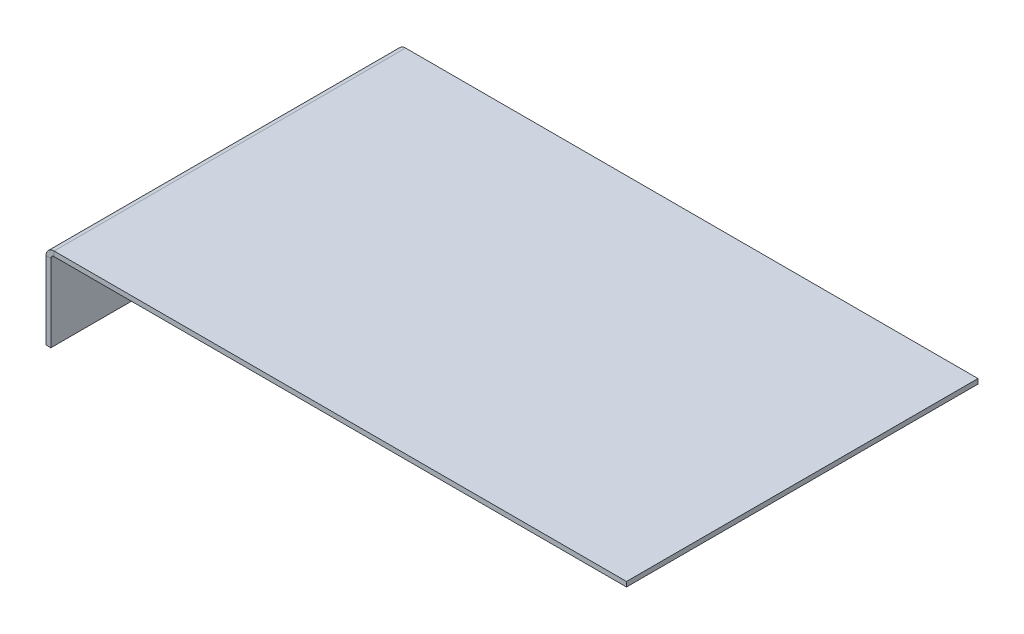
ISO-10303-21;
HEADER;
FILE_DESCRIPTION(('STEP AP214'),'2;1');
FILE_NAME('part.step','',(''),(''),'','','');
FILE_SCHEMA(('AUTOMOTIVE_DESIGN { 1 0 10303 214 1 1 1 1 }'));
ENDSEC;
DATA;
#1=APPLICATION_CONTEXT('core data for automotive mechanical design processes');
#2=APPLICATION_PROTOCOL_DEFINITION('international standard','automotive_design',2000,#1);
#3=PRODUCT_CONTEXT('',#1,'mechanical');
#4=PRODUCT('Part','Part','',(#3));
#5=PRODUCT_RELATED_PRODUCT_CATEGORY('part','',(#4));
#6=PRODUCT_DEFINITION_FORMATION('','',#4);
#7=PRODUCT_DEFINITION_CONTEXT('part definition',#1,'design');
#8=PRODUCT_DEFINITION('design','',#6,#7);
#9=PRODUCT_DEFINITION_SHAPE('','',#8);
#10=(LENGTH_UNIT() NAMED_UNIT(*) SI_UNIT(.MILLI.,.METRE.));
#11=(NAMED_UNIT(*) PLANE_ANGLE_UNIT() SI_UNIT($,.RADIAN.));
#12=(NAMED_UNIT(*) SI_UNIT($,.STERADIAN.) SOLID_ANGLE_UNIT());
#13=UNCERTAINTY_MEASURE_WITH_UNIT(LENGTH_MEASURE(1.E-05),#10,'distance_accuracy_value','');
#14=(GEOMETRIC_REPRESENTATION_CONTEXT(3) GLOBAL_UNCERTAINTY_ASSIGNED_CONTEXT((#13)) GLOBAL_UNIT_ASSIGNED_CONTEXT((#10,
#11,#12)) REPRESENTATION_CONTEXT('',''));
#15=CARTESIAN_POINT('',(0.,0.,0.));
#16=DIRECTION('',(0.,0.,1.));
#17=DIRECTION('',(1.,0.,0.));
#18=AXIS2_PLACEMENT_3D('',#15,#16,#17);
#19=CARTESIAN_POINT('',(-90.,-1.5,-54.5));
#20=DIRECTION('',(0.,0.,-1.));
#21=DIRECTION('',(-1.,0.,0.));
#22=AXIS2_PLACEMENT_3D('',#19,#20,#21);
#23=PLANE('',#22);
#24=DIRECTION('',(-1.,0.,0.));
#25=VECTOR('',#24,1.);
#26=CARTESIAN_POINT('',(-90.,-1.5,-54.5));
#27=LINE('',#26,#25);
#28=CARTESIAN_POINT('',(90.,-1.5,-54.5));
#29=VERTEX_POINT('',#28);
#30=CARTESIAN_POINT('',(-87.5,-1.5,-54.5));
#31=VERTEX_POINT('',#30);
#32=EDGE_CURVE('E195',#29,#31,#27,.T.);
#33=ORIENTED_EDGE('',*,*,#32,.T.);
#34=DIRECTION('',(0.,1.,0.));
#35=VECTOR('',#34,1.);
#36=CARTESIAN_POINT('',(-87.5,-1.5,-54.5));
#37=LINE('',#36,#35);
#38=CARTESIAN_POINT('',(-87.5,0.,-54.5));
#39=VERTEX_POINT('',#38);
#40=EDGE_CURVE('E183',#31,#39,#37,.T.);
#41=ORIENTED_EDGE('',*,*,#40,.T.);
#42=DIRECTION('',(-1.,0.,0.));
#43=VECTOR('',#42,1.);
#44=CARTESIAN_POINT('',(-90.,0.,-54.5));
#45=LINE('',#44,#43);
#46=CARTESIAN_POINT('',(90.,0.,-54.5));
#47=VERTEX_POINT('',#46);
#48=EDGE_CURVE('E202',#47,#39,#45,.T.);
#49=ORIENTED_EDGE('',*,*,#48,.F.);
#50=DIRECTION('',(0.,1.,0.));
#51=VECTOR('',#50,1.);
#52=CARTESIAN_POINT('',(90.,-1.5,-54.5));
#53=LINE('',#52,#51);
#54=EDGE_CURVE('E63',#29,#47,#53,.T.);
#55=ORIENTED_EDGE('',*,*,#54,.F.);
#56=EDGE_LOOP('',(#33,#41,#49,#55));
#57=FACE_BOUND('',#56,.T.);
#58=ADVANCED_FACE('F59',(#57),#23,.T.);
#59=CARTESIAN_POINT('',(0.,-1.5,0.));
#60=DIRECTION('',(0.,-1.,0.));
#61=DIRECTION('',(0.,0.,-1.));
#62=AXIS2_PLACEMENT_3D('',#59,#60,#61);
#63=PLANE('',#62);
#64=DIRECTION('',(1.,0.,0.));
#65=VECTOR('',#64,1.);
#66=CARTESIAN_POINT('',(-90.,-1.5,54.5));
#67=LINE('',#66,#65);
#68=CARTESIAN_POINT('',(-87.5,-1.5,54.5));
#69=VERTEX_POINT('',#68);
#70=CARTESIAN_POINT('',(90.,-1.5,54.5));
#71=VERTEX_POINT('',#70);
#72=EDGE_CURVE('E198',#69,#71,#67,.T.);
#73=ORIENTED_EDGE('',*,*,#72,.F.);
#74=DIRECTION('',(0.,0.,-1.));
#75=VECTOR('',#74,1.);
#76=CARTESIAN_POINT('',(-87.5,-1.5,-54.5));
#77=LINE('',#76,#75);
#78=EDGE_CURVE('E74',#31,#69,#77,.F.);
#79=ORIENTED_EDGE('',*,*,#78,.F.);
#80=ORIENTED_EDGE('',*,*,#32,.F.);
#81=DIRECTION('',(0.,0.,-1.));
#82=VECTOR('',#81,1.);
#83=CARTESIAN_POINT('',(90.,-1.5,54.5));
#84=LINE('',#83,#82);
#85=EDGE_CURVE('E192',#71,#29,#84,.T.);
#86=ORIENTED_EDGE('',*,*,#85,.F.);
#87=EDGE_LOOP('',(#73,#79,#80,#86));
#88=FACE_BOUND('',#87,.T.);
#89=ADVANCED_FACE('F236',(#88),#63,.T.);
#90=CARTESIAN_POINT('',(0.,0.,0.));
#91=DIRECTION('',(0.,-1.,0.));
#92=DIRECTION('',(0.,0.,-1.));
#93=AXIS2_PLACEMENT_3D('',#90,#91,#92);
#94=PLANE('',#93);
#95=DIRECTION('',(0.,0.,-1.));
#96=VECTOR('',#95,1.);
#97=CARTESIAN_POINT('',(-87.5,0.,-54.5));
#98=LINE('',#97,#96);
#99=CARTESIAN_POINT('',(-87.5,0.,54.5));
#100=VERTEX_POINT('',#99);
#101=EDGE_CURVE('E133',#39,#100,#98,.F.);
#102=ORIENTED_EDGE('',*,*,#101,.T.);
#103=DIRECTION('',(1.,0.,0.));
#104=VECTOR('',#103,1.);
#105=CARTESIAN_POINT('',(-90.,0.,54.5));
#106=LINE('',#105,#104);
#107=CARTESIAN_POINT('',(90.,0.,54.5));
#108=VERTEX_POINT('',#107);
#109=EDGE_CURVE('E196',#100,#108,#106,.T.);
#110=ORIENTED_EDGE('',*,*,#109,.T.);
#111=DIRECTION('',(0.,0.,-1.));
#112=VECTOR('',#111,1.);
#113=CARTESIAN_POINT('',(90.,0.,54.5));
#114=LINE('',#113,#112);
#115=EDGE_CURVE('E190',#108,#47,#114,.T.);
#116=ORIENTED_EDGE('',*,*,#115,.T.);
#117=ORIENTED_EDGE('',*,*,#48,.T.);
#118=EDGE_LOOP('',(#102,#110,#116,#117));
#119=FACE_BOUND('',#118,.T.);
#120=ADVANCED_FACE('F206',(#119),#94,.F.);
#121=CARTESIAN_POINT('',(90.,-1.5,54.5));
#122=DIRECTION('',(1.,0.,0.));
#123=DIRECTION('',(0.,0.,-1.));
#124=AXIS2_PLACEMENT_3D('',#121,#122,#123);
#125=PLANE('',#124);
#126=ORIENTED_EDGE('',*,*,#115,.F.);
#127=DIRECTION('',(0.,1.,0.));
#128=VECTOR('',#127,1.);
#129=CARTESIAN_POINT('',(90.,-1.5,54.5));
#130=LINE('',#129,#128);
#131=EDGE_CURVE('E13',#71,#108,#130,.T.);
#132=ORIENTED_EDGE('',*,*,#131,.F.);
#133=ORIENTED_EDGE('',*,*,#85,.T.);
#134=ORIENTED_EDGE('',*,*,#54,.T.);
#135=EDGE_LOOP('',(#126,#132,#133,#134));
#136=FACE_BOUND('',#135,.T.);
#137=ADVANCED_FACE('F61',(#136),#125,.T.);
#138=CARTESIAN_POINT('',(-90.,-1.5,54.5));
#139=DIRECTION('',(0.,0.,1.));
#140=DIRECTION('',(1.,0.,0.));
#141=AXIS2_PLACEMENT_3D('',#138,#139,#140);
#142=PLANE('',#141);
#143=DIRECTION('',(0.,1.,0.));
#144=VECTOR('',#143,1.);
#145=CARTESIAN_POINT('',(-87.5,-1.5,54.5));
#146=LINE('',#145,#144);
#147=EDGE_CURVE('E82',#69,#100,#146,.T.);
#148=ORIENTED_EDGE('',*,*,#147,.F.);
#149=ORIENTED_EDGE('',*,*,#72,.T.);
#150=ORIENTED_EDGE('',*,*,#131,.T.);
#151=ORIENTED_EDGE('',*,*,#109,.F.);
#152=EDGE_LOOP('',(#148,#149,#150,#151));
#153=FACE_BOUND('',#152,.T.);
#154=ADVANCED_FACE('F209',(#153),#142,.T.);
#155=CARTESIAN_POINT('',(-87.5,-2.50000000000001,54.5));
#156=DIRECTION('',(0.,0.,1.));
#157=DIRECTION('',(1.,0.,0.));
#158=AXIS2_PLACEMENT_3D('',#155,#156,#157);
#159=PLANE('',#158);
#160=DIRECTION('',(-1.,0.,0.));
#161=VECTOR('',#160,1.);
#162=CARTESIAN_POINT('',(-90.,-2.5,54.5));
#163=LINE('',#162,#161);
#164=CARTESIAN_POINT('',(-88.5,-2.5,54.5));
#165=VERTEX_POINT('',#164);
#166=CARTESIAN_POINT('',(-90.,-2.5,54.5));
#167=VERTEX_POINT('',#166);
#168=EDGE_CURVE('E178',#165,#167,#163,.T.);
#169=ORIENTED_EDGE('',*,*,#168,.F.);
#170=CARTESIAN_POINT('',(-87.5,-2.50000000000001,54.5));
#171=DIRECTION('',(0.,0.,-1.));
#172=DIRECTION('',(-1.,0.,0.));
#173=AXIS2_PLACEMENT_3D('',#170,#171,#172);
#174=CIRCLE('',#173,1.);
#175=EDGE_CURVE('E136',#69,#165,#174,.F.);
#176=ORIENTED_EDGE('',*,*,#175,.F.);
#177=ORIENTED_EDGE('',*,*,#147,.T.);
#178=CARTESIAN_POINT('',(-87.5,-2.50000000000001,54.5));
#179=DIRECTION('',(0.,0.,-1.));
#180=DIRECTION('',(-1.,0.,0.));
#181=AXIS2_PLACEMENT_3D('',#178,#179,#180);
#182=CIRCLE('',#181,2.5);
#183=EDGE_CURVE('E182',#100,#167,#182,.F.);
#184=ORIENTED_EDGE('',*,*,#183,.T.);
#185=EDGE_LOOP('',(#169,#176,#177,#184));
#186=FACE_BOUND('',#185,.T.);
#187=ADVANCED_FACE('F244',(#186),#159,.T.);
#188=CARTESIAN_POINT('',(-87.5,-2.50000000000001,-54.5));
#189=DIRECTION('',(0.,0.,1.));
#190=DIRECTION('',(1.,0.,0.));
#191=AXIS2_PLACEMENT_3D('',#188,#189,#190);
#192=PLANE('',#191);
#193=CARTESIAN_POINT('',(-87.5,-2.50000000000001,-54.5));
#194=DIRECTION('',(0.,0.,-1.));
#195=DIRECTION('',(-1.,0.,0.));
#196=AXIS2_PLACEMENT_3D('',#193,#194,#195);
#197=CIRCLE('',#196,1.);
#198=CARTESIAN_POINT('',(-88.5,-2.5,-54.5));
#199=VERTEX_POINT('',#198);
#200=EDGE_CURVE('E143',#199,#31,#197,.T.);
#201=ORIENTED_EDGE('',*,*,#200,.F.);
#202=DIRECTION('',(-1.,0.,0.));
#203=VECTOR('',#202,1.);
#204=CARTESIAN_POINT('',(-88.5,-2.5,-54.5));
#205=LINE('',#204,#203);
#206=CARTESIAN_POINT('',(-90.,-2.5,-54.5));
#207=VERTEX_POINT('',#206);
#208=EDGE_CURVE('E140',#199,#207,#205,.T.);
#209=ORIENTED_EDGE('',*,*,#208,.T.);
#210=CARTESIAN_POINT('',(-87.5,-2.50000000000001,-54.5));
#211=DIRECTION('',(0.,0.,-1.));
#212=DIRECTION('',(-1.,0.,0.));
#213=AXIS2_PLACEMENT_3D('',#210,#211,#212);
#214=CIRCLE('',#213,2.5);
#215=EDGE_CURVE('E126',#207,#39,#214,.T.);
#216=ORIENTED_EDGE('',*,*,#215,.T.);
#217=ORIENTED_EDGE('',*,*,#40,.F.);
#218=EDGE_LOOP('',(#201,#209,#216,#217));
#219=FACE_BOUND('',#218,.T.);
#220=ADVANCED_FACE('F141',(#219),#192,.F.);
#221=CARTESIAN_POINT('',(-87.5,-2.50000000000001,-54.5));
#222=DIRECTION('',(0.,0.,-1.));
#223=DIRECTION('',(-1.,0.,0.));
#224=AXIS2_PLACEMENT_3D('',#221,#222,#223);
#225=CYLINDRICAL_SURFACE('',#224,2.5);
#226=ORIENTED_EDGE('',*,*,#101,.F.);
#227=ORIENTED_EDGE('',*,*,#215,.F.);
#228=DIRECTION('',(0.,0.,-1.));
#229=VECTOR('',#228,1.);
#230=CARTESIAN_POINT('',(-90.,-2.5,0.));
#231=LINE('',#230,#229);
#232=EDGE_CURVE('E131',#167,#207,#231,.T.);
#233=ORIENTED_EDGE('',*,*,#232,.F.);
#234=ORIENTED_EDGE('',*,*,#183,.F.);
#235=EDGE_LOOP('',(#226,#227,#233,#234));
#236=FACE_BOUND('',#235,.T.);
#237=ADVANCED_FACE('F128',(#236),#225,.T.);
#238=CARTESIAN_POINT('',(-87.5,-2.50000000000001,-54.5));
#239=DIRECTION('',(0.,0.,-1.));
#240=DIRECTION('',(-1.,0.,0.));
#241=AXIS2_PLACEMENT_3D('',#238,#239,#240);
#242=CYLINDRICAL_SURFACE('',#241,1.);
#243=ORIENTED_EDGE('',*,*,#78,.T.);
#244=ORIENTED_EDGE('',*,*,#175,.T.);
#245=DIRECTION('',(0.,0.,1.));
#246=VECTOR('',#245,1.);
#247=CARTESIAN_POINT('',(-88.5,-2.5,54.5));
#248=LINE('',#247,#246);
#249=EDGE_CURVE('E148',#165,#199,#248,.F.);
#250=ORIENTED_EDGE('',*,*,#249,.T.);
#251=ORIENTED_EDGE('',*,*,#200,.T.);
#252=EDGE_LOOP('',(#243,#244,#250,#251));
#253=FACE_BOUND('',#252,.T.);
#254=ADVANCED_FACE('F215',(#253),#242,.F.);
#255=CARTESIAN_POINT('',(-90.,-1.49999999999999,-54.5));
#256=DIRECTION('',(0.,0.,-1.));
#257=DIRECTION('',(-1.,0.,0.));
#258=AXIS2_PLACEMENT_3D('',#255,#256,#257);
#259=PLANE('',#258);
#260=DIRECTION('',(0.,1.,0.));
#261=VECTOR('',#260,1.);
#262=CARTESIAN_POINT('',(-90.,-1.49999999999999,-54.5));
#263=LINE('',#262,#261);
#264=CARTESIAN_POINT('',(-90.0000000000001,-26.5,-54.5));
#265=VERTEX_POINT('',#264);
#266=EDGE_CURVE('E155',#265,#207,#263,.T.);
#267=ORIENTED_EDGE('',*,*,#266,.T.);
#268=ORIENTED_EDGE('',*,*,#208,.F.);
#269=DIRECTION('',(0.,-1.,0.));
#270=VECTOR('',#269,1.);
#271=CARTESIAN_POINT('',(-88.5,2.99760216648792E-13,-54.5));
#272=LINE('',#271,#270);
#273=CARTESIAN_POINT('',(-88.5000000000001,-26.5,-54.5));
#274=VERTEX_POINT('',#273);
#275=EDGE_CURVE('E171',#274,#199,#272,.F.);
#276=ORIENTED_EDGE('',*,*,#275,.F.);
#277=DIRECTION('',(1.,0.,0.));
#278=VECTOR('',#277,1.);
#279=CARTESIAN_POINT('',(-90.0000000000001,-26.5,-54.5));
#280=LINE('',#279,#278);
#281=EDGE_CURVE('E160',#265,#274,#280,.T.);
#282=ORIENTED_EDGE('',*,*,#281,.F.);
#283=EDGE_LOOP('',(#267,#268,#276,#282));
#284=FACE_BOUND('',#283,.T.);
#285=ADVANCED_FACE('F159',(#284),#259,.T.);
#286=CARTESIAN_POINT('',(-90.0000000000001,-26.5,54.5));
#287=DIRECTION('',(0.,0.,1.));
#288=DIRECTION('',(1.,0.,0.));
#289=AXIS2_PLACEMENT_3D('',#286,#287,#288);
#290=PLANE('',#289);
#291=DIRECTION('',(0.,1.,0.));
#292=VECTOR('',#291,1.);
#293=CARTESIAN_POINT('',(-88.5,2.99760216648792E-13,54.5));
#294=LINE('',#293,#292);
#295=CARTESIAN_POINT('',(-88.5000000000001,-26.5,54.5));
#296=VERTEX_POINT('',#295);
#297=EDGE_CURVE('E157',#165,#296,#294,.F.);
#298=ORIENTED_EDGE('',*,*,#297,.F.);
#299=ORIENTED_EDGE('',*,*,#168,.T.);
#300=DIRECTION('',(0.,-1.,0.));
#301=VECTOR('',#300,1.);
#302=CARTESIAN_POINT('',(-90.0000000000001,-26.5,54.5));
#303=LINE('',#302,#301);
#304=CARTESIAN_POINT('',(-90.0000000000001,-26.5,54.5));
#305=VERTEX_POINT('',#304);
#306=EDGE_CURVE('E156',#167,#305,#303,.T.);
#307=ORIENTED_EDGE('',*,*,#306,.T.);
#308=DIRECTION('',(1.,0.,0.));
#309=VECTOR('',#308,1.);
#310=CARTESIAN_POINT('',(-90.0000000000001,-26.5,54.5));
#311=LINE('',#310,#309);
#312=EDGE_CURVE('E162',#305,#296,#311,.T.);
#313=ORIENTED_EDGE('',*,*,#312,.T.);
#314=EDGE_LOOP('',(#298,#299,#307,#313));
#315=FACE_BOUND('',#314,.T.);
#316=ADVANCED_FACE('F222',(#315),#290,.T.);
#317=CARTESIAN_POINT('',(-90.,3.04997438657057E-13,0.));
#318=DIRECTION('',(-1.,0.,0.));
#319=DIRECTION('',(0.,-1.,0.));
#320=AXIS2_PLACEMENT_3D('',#317,#318,#319);
#321=PLANE('',#320);
#322=ORIENTED_EDGE('',*,*,#306,.F.);
#323=ORIENTED_EDGE('',*,*,#232,.T.);
#324=ORIENTED_EDGE('',*,*,#266,.F.);
#325=DIRECTION('',(0.,0.,-1.));
#326=VECTOR('',#325,1.);
#327=CARTESIAN_POINT('',(-90.0000000000001,-26.5,-54.5));
#328=LINE('',#327,#326);
#329=EDGE_CURVE('E163',#305,#265,#328,.T.);
#330=ORIENTED_EDGE('',*,*,#329,.F.);
#331=EDGE_LOOP('',(#322,#323,#324,#330));
#332=FACE_BOUND('',#331,.T.);
#333=ADVANCED_FACE('F153',(#332),#321,.T.);
#334=CARTESIAN_POINT('',(-88.5,2.99760216648792E-13,0.));
#335=DIRECTION('',(-1.,0.,0.));
#336=DIRECTION('',(0.,-1.,0.));
#337=AXIS2_PLACEMENT_3D('',#334,#335,#336);
#338=PLANE('',#337);
#339=ORIENTED_EDGE('',*,*,#249,.F.);
#340=ORIENTED_EDGE('',*,*,#297,.T.);
#341=DIRECTION('',(0.,0.,1.));
#342=VECTOR('',#341,1.);
#343=CARTESIAN_POINT('',(-88.5000000000001,-26.5,0.));
#344=LINE('',#343,#342);
#345=EDGE_CURVE('E173',#296,#274,#344,.F.);
#346=ORIENTED_EDGE('',*,*,#345,.T.);
#347=ORIENTED_EDGE('',*,*,#275,.T.);
#348=EDGE_LOOP('',(#339,#340,#346,#347));
#349=FACE_BOUND('',#348,.T.);
#350=ADVANCED_FACE('F220',(#349),#338,.F.);
#351=CARTESIAN_POINT('',(-90.0000000000001,-26.5,-54.5));
#352=DIRECTION('',(0.,-1.,0.));
#353=DIRECTION('',(1.,0.,0.));
#354=AXIS2_PLACEMENT_3D('',#351,#352,#353);
#355=PLANE('',#354);
#356=ORIENTED_EDGE('',*,*,#345,.F.);
#357=ORIENTED_EDGE('',*,*,#312,.F.);
#358=ORIENTED_EDGE('',*,*,#329,.T.);
#359=ORIENTED_EDGE('',*,*,#281,.T.);
#360=EDGE_LOOP('',(#356,#357,#358,#359));
#361=FACE_BOUND('',#360,.T.);
#362=ADVANCED_FACE('F226',(#361),#355,.T.);
#363=CLOSED_SHELL('',(#58,#89,#120,#137,#154,#187,#220,#237,#254,#285,#316,#333,#350,#362));
#364=MANIFOLD_SOLID_BREP('B2',#363);
#365=ADVANCED_BREP_SHAPE_REPRESENTATION('',(#18,#364),#14);
#366=SHAPE_DEFINITION_REPRESENTATION(#9,#365);
ENDSEC;
END-ISO-10303-21;
